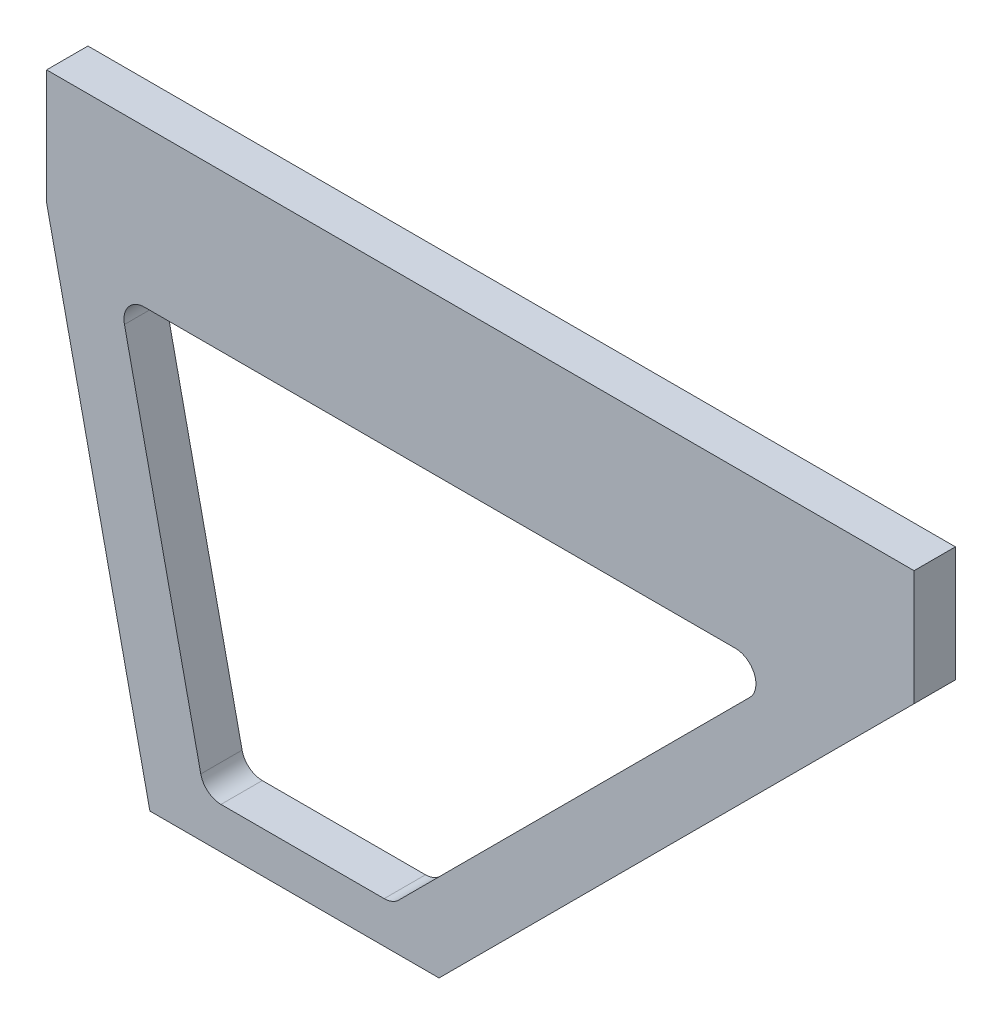
ISO-10303-21;
HEADER;
FILE_DESCRIPTION(('STEP AP214'),'2;1');
FILE_NAME('part.step','',(''),(''),'','','');
FILE_SCHEMA(('AUTOMOTIVE_DESIGN { 1 0 10303 214 1 1 1 1 }'));
ENDSEC;
DATA;
#1=APPLICATION_CONTEXT('core data for automotive mechanical design processes');
#2=APPLICATION_PROTOCOL_DEFINITION('international standard','automotive_design',2000,#1);
#3=PRODUCT_CONTEXT('',#1,'mechanical');
#4=PRODUCT('Part','Part','',(#3));
#5=PRODUCT_RELATED_PRODUCT_CATEGORY('part','',(#4));
#6=PRODUCT_DEFINITION_FORMATION('','',#4);
#7=PRODUCT_DEFINITION_CONTEXT('part definition',#1,'design');
#8=PRODUCT_DEFINITION('design','',#6,#7);
#9=PRODUCT_DEFINITION_SHAPE('','',#8);
#10=(LENGTH_UNIT() NAMED_UNIT(*) SI_UNIT(.MILLI.,.METRE.));
#11=(NAMED_UNIT(*) PLANE_ANGLE_UNIT() SI_UNIT($,.RADIAN.));
#12=(NAMED_UNIT(*) SI_UNIT($,.STERADIAN.) SOLID_ANGLE_UNIT());
#13=UNCERTAINTY_MEASURE_WITH_UNIT(LENGTH_MEASURE(1.E-05),#10,'distance_accuracy_value','');
#14=(GEOMETRIC_REPRESENTATION_CONTEXT(3) GLOBAL_UNCERTAINTY_ASSIGNED_CONTEXT((#13)) GLOBAL_UNIT_ASSIGNED_CONTEXT((#10,
#11,#12)) REPRESENTATION_CONTEXT('',''));
#15=CARTESIAN_POINT('',(0.,0.,0.));
#16=DIRECTION('',(0.,0.,1.));
#17=DIRECTION('',(1.,0.,0.));
#18=AXIS2_PLACEMENT_3D('',#15,#16,#17);
#19=CARTESIAN_POINT('',(0.,0.,5.));
#20=DIRECTION('',(0.,0.,-1.));
#21=DIRECTION('',(-1.,0.,0.));
#22=AXIS2_PLACEMENT_3D('',#19,#20,#21);
#23=PLANE('',#22);
#24=DIRECTION('',(0.,-1.,0.));
#25=VECTOR('',#24,1.);
#26=CARTESIAN_POINT('',(-30.1972094569569,-50.2390348397523,5.));
#27=LINE('',#26,#25);
#28=CARTESIAN_POINT('',(-30.1972094569569,-22.3390348397454,5.));
#29=VERTEX_POINT('',#28);
#30=CARTESIAN_POINT('',(-30.1972094569569,-50.2390348397523,5.));
#31=VERTEX_POINT('',#30);
#32=EDGE_CURVE('E146',#29,#31,#27,.T.);
#33=ORIENTED_EDGE('',*,*,#32,.T.);
#34=DIRECTION('',(0.21242964433104,-0.977176363922802,0.));
#35=VECTOR('',#34,1.);
#36=CARTESIAN_POINT('',(-30.1972094569569,-50.2390348397523,5.));
#37=LINE('',#36,#35);
#38=CARTESIAN_POINT('',(-5.19720945695734,-165.239034839752,5.));
#39=VERTEX_POINT('',#38);
#40=EDGE_CURVE('E135',#31,#39,#37,.T.);
#41=ORIENTED_EDGE('',*,*,#40,.T.);
#42=DIRECTION('',(1.,0.,0.));
#43=VECTOR('',#42,1.);
#44=CARTESIAN_POINT('',(64.8027905430427,-165.239034839752,5.));
#45=LINE('',#44,#43);
#46=CARTESIAN_POINT('',(64.8027905430427,-165.239034839752,5.));
#47=VERTEX_POINT('',#46);
#48=EDGE_CURVE('E145',#39,#47,#45,.T.);
#49=ORIENTED_EDGE('',*,*,#48,.T.);
#50=DIRECTION('',(0.707106781186549,0.707106781186546,0.));
#51=VECTOR('',#50,1.);
#52=CARTESIAN_POINT('',(179.802790543043,-50.2390348397523,5.));
#53=LINE('',#52,#51);
#54=CARTESIAN_POINT('',(179.802790543043,-50.2390348397523,5.));
#55=VERTEX_POINT('',#54);
#56=EDGE_CURVE('E230',#47,#55,#53,.T.);
#57=ORIENTED_EDGE('',*,*,#56,.T.);
#58=DIRECTION('',(0.,1.,0.));
#59=VECTOR('',#58,1.);
#60=CARTESIAN_POINT('',(179.802790543043,-22.3390348397454,5.));
#61=LINE('',#60,#59);
#62=CARTESIAN_POINT('',(179.802790543043,-22.3390348397454,5.));
#63=VERTEX_POINT('',#62);
#64=EDGE_CURVE('E232',#55,#63,#61,.T.);
#65=ORIENTED_EDGE('',*,*,#64,.T.);
#66=DIRECTION('',(-1.,0.,0.));
#67=VECTOR('',#66,1.);
#68=CARTESIAN_POINT('',(-30.1972094569569,-22.3390348397454,5.));
#69=LINE('',#68,#67);
#70=EDGE_CURVE('E150',#63,#29,#69,.T.);
#71=ORIENTED_EDGE('',*,*,#70,.T.);
#72=EDGE_LOOP('',(#33,#41,#49,#57,#65,#71));
#73=FACE_BOUND('',#72,.T.);
#74=DIRECTION('',(1.,0.,0.));
#75=VECTOR('',#74,1.);
#76=CARTESIAN_POINT('',(53.5895871074462,-155.239034839753,5.));
#77=LINE('',#76,#75);
#78=CARTESIAN_POINT('',(12.0090554055467,-155.239034839753,5.));
#79=VERTEX_POINT('',#78);
#80=CARTESIAN_POINT('',(51.5185192955807,-155.239034839753,5.));
#81=VERTEX_POINT('',#80);
#82=EDGE_CURVE('E212',#79,#81,#77,.T.);
#83=ORIENTED_EDGE('',*,*,#82,.F.);
#84=CARTESIAN_POINT('',(12.0090554055467,-150.239034839753,5.));
#85=DIRECTION('',(0.,0.,-1.));
#86=DIRECTION('',(-1.,0.,0.));
#87=AXIS2_PLACEMENT_3D('',#84,#85,#86);
#88=CIRCLE('',#87,5.);
#89=CARTESIAN_POINT('',(7.12317358593271,-151.301183061408,5.));
#90=VERTEX_POINT('',#89);
#91=EDGE_CURVE('E193',#79,#90,#88,.T.);
#92=ORIENTED_EDGE('',*,*,#91,.T.);
#93=DIRECTION('',(0.21242964433104,-0.977176363922802,0.));
#94=VECTOR('',#93,1.);
#95=CARTESIAN_POINT('',(-12.6729455926877,-60.2390348397523,5.));
#96=LINE('',#95,#94);
#97=CARTESIAN_POINT('',(-11.3550872836322,-66.3011830614075,5.));
#98=VERTEX_POINT('',#97);
#99=EDGE_CURVE('E224',#98,#90,#96,.T.);
#100=ORIENTED_EDGE('',*,*,#99,.F.);
#101=CARTESIAN_POINT('',(-6.46920546401825,-65.2390348397523,5.));
#102=DIRECTION('',(0.,0.,-1.));
#103=DIRECTION('',(-1.,0.,0.));
#104=AXIS2_PLACEMENT_3D('',#101,#102,#103);
#105=CIRCLE('',#104,5.);
#106=CARTESIAN_POINT('',(-6.46920546401825,-60.2390348397523,5.));
#107=VERTEX_POINT('',#106);
#108=EDGE_CURVE('E189',#98,#107,#105,.T.);
#109=ORIENTED_EDGE('',*,*,#108,.T.);
#110=DIRECTION('',(-1.,0.,0.));
#111=VECTOR('',#110,1.);
#112=CARTESIAN_POINT('',(148.589587107447,-60.2390348397523,5.));
#113=LINE('',#112,#111);
#114=CARTESIAN_POINT('',(136.518519295581,-60.2390348397523,5.));
#115=VERTEX_POINT('',#114);
#116=EDGE_CURVE('E217',#115,#107,#113,.T.);
#117=ORIENTED_EDGE('',*,*,#116,.F.);
#118=CARTESIAN_POINT('',(136.518519295581,-65.2390348397523,5.));
#119=DIRECTION('',(0.,0.,-1.));
#120=DIRECTION('',(-1.,0.,0.));
#121=AXIS2_PLACEMENT_3D('',#118,#119,#120);
#122=CIRCLE('',#121,5.);
#123=CARTESIAN_POINT('',(140.054053201514,-68.7745687456851,5.));
#124=VERTEX_POINT('',#123);
#125=EDGE_CURVE('E185',#115,#124,#122,.T.);
#126=ORIENTED_EDGE('',*,*,#125,.T.);
#127=DIRECTION('',(0.707106781186547,0.707106781186548,0.));
#128=VECTOR('',#127,1.);
#129=CARTESIAN_POINT('',(53.5895871074462,-155.239034839753,5.));
#130=LINE('',#129,#128);
#131=CARTESIAN_POINT('',(55.0540532015134,-153.774568745685,5.));
#132=VERTEX_POINT('',#131);
#133=EDGE_CURVE('E214',#132,#124,#130,.T.);
#134=ORIENTED_EDGE('',*,*,#133,.F.);
#135=CARTESIAN_POINT('',(51.5185192955807,-150.239034839753,5.));
#136=DIRECTION('',(0.,0.,-1.));
#137=DIRECTION('',(-1.,0.,0.));
#138=AXIS2_PLACEMENT_3D('',#135,#136,#137);
#139=CIRCLE('',#138,5.);
#140=EDGE_CURVE('E11',#132,#81,#139,.T.);
#141=ORIENTED_EDGE('',*,*,#140,.T.);
#142=EDGE_LOOP('',(#83,#92,#100,#109,#117,#126,#134,#141));
#143=FACE_BOUND('',#142,.T.);
#144=ADVANCED_FACE('F34',(#73,#143),#23,.F.);
#145=CARTESIAN_POINT('',(0.,0.,-5.));
#146=DIRECTION('',(0.,0.,-1.));
#147=DIRECTION('',(-1.,0.,0.));
#148=AXIS2_PLACEMENT_3D('',#145,#146,#147);
#149=PLANE('',#148);
#150=DIRECTION('',(0.,-1.,0.));
#151=VECTOR('',#150,1.);
#152=CARTESIAN_POINT('',(-30.1972094569569,-50.2390348397523,-5.));
#153=LINE('',#152,#151);
#154=CARTESIAN_POINT('',(-30.1972094569569,-22.3390348397454,-5.));
#155=VERTEX_POINT('',#154);
#156=CARTESIAN_POINT('',(-30.1972094569569,-50.2390348397523,-5.));
#157=VERTEX_POINT('',#156);
#158=EDGE_CURVE('E158',#155,#157,#153,.T.);
#159=ORIENTED_EDGE('',*,*,#158,.F.);
#160=DIRECTION('',(-1.,0.,0.));
#161=VECTOR('',#160,1.);
#162=CARTESIAN_POINT('',(-30.1972094569569,-22.3390348397454,-5.));
#163=LINE('',#162,#161);
#164=CARTESIAN_POINT('',(179.802790543043,-22.3390348397454,-5.));
#165=VERTEX_POINT('',#164);
#166=EDGE_CURVE('E154',#165,#155,#163,.T.);
#167=ORIENTED_EDGE('',*,*,#166,.F.);
#168=DIRECTION('',(0.,1.,0.));
#169=VECTOR('',#168,1.);
#170=CARTESIAN_POINT('',(179.802790543043,-22.3390348397454,-5.));
#171=LINE('',#170,#169);
#172=CARTESIAN_POINT('',(179.802790543043,-50.2390348397523,-5.));
#173=VERTEX_POINT('',#172);
#174=EDGE_CURVE('E243',#173,#165,#171,.T.);
#175=ORIENTED_EDGE('',*,*,#174,.F.);
#176=DIRECTION('',(0.707106781186549,0.707106781186546,0.));
#177=VECTOR('',#176,1.);
#178=CARTESIAN_POINT('',(179.802790543043,-50.2390348397523,-5.));
#179=LINE('',#178,#177);
#180=CARTESIAN_POINT('',(64.8027905430427,-165.239034839752,-5.));
#181=VERTEX_POINT('',#180);
#182=EDGE_CURVE('E241',#181,#173,#179,.T.);
#183=ORIENTED_EDGE('',*,*,#182,.F.);
#184=DIRECTION('',(1.,0.,0.));
#185=VECTOR('',#184,1.);
#186=CARTESIAN_POINT('',(64.8027905430427,-165.239034839752,-5.));
#187=LINE('',#186,#185);
#188=CARTESIAN_POINT('',(-5.19720945695734,-165.239034839752,-5.));
#189=VERTEX_POINT('',#188);
#190=EDGE_CURVE('E239',#189,#181,#187,.T.);
#191=ORIENTED_EDGE('',*,*,#190,.F.);
#192=DIRECTION('',(0.21242964433104,-0.977176363922802,0.));
#193=VECTOR('',#192,1.);
#194=CARTESIAN_POINT('',(-30.1972094569569,-50.2390348397523,-5.));
#195=LINE('',#194,#193);
#196=EDGE_CURVE('E237',#157,#189,#195,.T.);
#197=ORIENTED_EDGE('',*,*,#196,.F.);
#198=EDGE_LOOP('',(#159,#167,#175,#183,#191,#197));
#199=FACE_BOUND('',#198,.T.);
#200=DIRECTION('',(-1.,0.,0.));
#201=VECTOR('',#200,1.);
#202=CARTESIAN_POINT('',(148.589587107447,-60.2390348397523,-5.));
#203=LINE('',#202,#201);
#204=CARTESIAN_POINT('',(136.518519295581,-60.2390348397523,-5.));
#205=VERTEX_POINT('',#204);
#206=CARTESIAN_POINT('',(-6.46920546401825,-60.2390348397523,-5.));
#207=VERTEX_POINT('',#206);
#208=EDGE_CURVE('E209',#205,#207,#203,.T.);
#209=ORIENTED_EDGE('',*,*,#208,.T.);
#210=CARTESIAN_POINT('',(-6.46920546401825,-65.2390348397523,-5.));
#211=DIRECTION('',(0.,0.,-1.));
#212=DIRECTION('',(-1.,0.,0.));
#213=AXIS2_PLACEMENT_3D('',#210,#211,#212);
#214=CIRCLE('',#213,5.);
#215=CARTESIAN_POINT('',(-11.3550872836322,-66.3011830614075,-5.));
#216=VERTEX_POINT('',#215);
#217=EDGE_CURVE('E187',#207,#216,#214,.F.);
#218=ORIENTED_EDGE('',*,*,#217,.T.);
#219=DIRECTION('',(0.21242964433104,-0.977176363922802,0.));
#220=VECTOR('',#219,1.);
#221=CARTESIAN_POINT('',(-12.6729455926877,-60.2390348397523,-5.));
#222=LINE('',#221,#220);
#223=CARTESIAN_POINT('',(7.12317358593271,-151.301183061408,-5.));
#224=VERTEX_POINT('',#223);
#225=EDGE_CURVE('E215',#216,#224,#222,.T.);
#226=ORIENTED_EDGE('',*,*,#225,.T.);
#227=CARTESIAN_POINT('',(12.0090554055467,-150.239034839753,-5.));
#228=DIRECTION('',(0.,0.,-1.));
#229=DIRECTION('',(-1.,0.,0.));
#230=AXIS2_PLACEMENT_3D('',#227,#228,#229);
#231=CIRCLE('',#230,5.);
#232=CARTESIAN_POINT('',(12.0090554055467,-155.239034839753,-5.));
#233=VERTEX_POINT('',#232);
#234=EDGE_CURVE('E191',#224,#233,#231,.F.);
#235=ORIENTED_EDGE('',*,*,#234,.T.);
#236=DIRECTION('',(1.,0.,0.));
#237=VECTOR('',#236,1.);
#238=CARTESIAN_POINT('',(53.5895871074462,-155.239034839753,-5.));
#239=LINE('',#238,#237);
#240=CARTESIAN_POINT('',(51.5185192955807,-155.239034839753,-5.));
#241=VERTEX_POINT('',#240);
#242=EDGE_CURVE('E201',#233,#241,#239,.T.);
#243=ORIENTED_EDGE('',*,*,#242,.T.);
#244=CARTESIAN_POINT('',(51.5185192955807,-150.239034839753,-5.));
#245=DIRECTION('',(0.,0.,-1.));
#246=DIRECTION('',(-1.,0.,0.));
#247=AXIS2_PLACEMENT_3D('',#244,#245,#246);
#248=CIRCLE('',#247,5.);
#249=CARTESIAN_POINT('',(55.0540532015134,-153.774568745685,-5.));
#250=VERTEX_POINT('',#249);
#251=EDGE_CURVE('E42',#241,#250,#248,.F.);
#252=ORIENTED_EDGE('',*,*,#251,.T.);
#253=DIRECTION('',(0.707106781186547,0.707106781186548,0.));
#254=VECTOR('',#253,1.);
#255=CARTESIAN_POINT('',(53.5895871074462,-155.239034839753,-5.));
#256=LINE('',#255,#254);
#257=CARTESIAN_POINT('',(140.054053201514,-68.7745687456851,-5.));
#258=VERTEX_POINT('',#257);
#259=EDGE_CURVE('E200',#250,#258,#256,.T.);
#260=ORIENTED_EDGE('',*,*,#259,.T.);
#261=CARTESIAN_POINT('',(136.518519295581,-65.2390348397523,-5.));
#262=DIRECTION('',(0.,0.,-1.));
#263=DIRECTION('',(-1.,0.,0.));
#264=AXIS2_PLACEMENT_3D('',#261,#262,#263);
#265=CIRCLE('',#264,5.);
#266=EDGE_CURVE('E183',#258,#205,#265,.F.);
#267=ORIENTED_EDGE('',*,*,#266,.T.);
#268=EDGE_LOOP('',(#209,#218,#226,#235,#243,#252,#260,#267));
#269=FACE_BOUND('',#268,.T.);
#270=ADVANCED_FACE('F199',(#199,#269),#149,.T.);
#271=CARTESIAN_POINT('',(-30.1972094569569,-50.2390348397523,5.));
#272=DIRECTION('',(1.,0.,0.));
#273=DIRECTION('',(0.,0.,-1.));
#274=AXIS2_PLACEMENT_3D('',#271,#272,#273);
#275=PLANE('',#274);
#276=ORIENTED_EDGE('',*,*,#158,.T.);
#277=DIRECTION('',(0.,0.,-1.));
#278=VECTOR('',#277,1.);
#279=CARTESIAN_POINT('',(-30.1972094569569,-50.2390348397523,5.));
#280=LINE('',#279,#278);
#281=EDGE_CURVE('E139',#31,#157,#280,.T.);
#282=ORIENTED_EDGE('',*,*,#281,.F.);
#283=ORIENTED_EDGE('',*,*,#32,.F.);
#284=DIRECTION('',(0.,0.,-1.));
#285=VECTOR('',#284,1.);
#286=CARTESIAN_POINT('',(-30.1972094569569,-22.3390348397454,5.));
#287=LINE('',#286,#285);
#288=EDGE_CURVE('E235',#29,#155,#287,.T.);
#289=ORIENTED_EDGE('',*,*,#288,.T.);
#290=EDGE_LOOP('',(#276,#282,#283,#289));
#291=FACE_BOUND('',#290,.T.);
#292=ADVANCED_FACE('F156',(#291),#275,.F.);
#293=CARTESIAN_POINT('',(-30.1972094569569,-50.2390348397523,5.));
#294=DIRECTION('',(0.977176363922802,0.21242964433104,0.));
#295=DIRECTION('',(-0.21242964433104,0.977176363922802,0.));
#296=AXIS2_PLACEMENT_3D('',#293,#294,#295);
#297=PLANE('',#296);
#298=ORIENTED_EDGE('',*,*,#196,.T.);
#299=DIRECTION('',(0.,0.,-1.));
#300=VECTOR('',#299,1.);
#301=CARTESIAN_POINT('',(-5.19720945695734,-165.239034839752,5.));
#302=LINE('',#301,#300);
#303=EDGE_CURVE('E142',#39,#189,#302,.T.);
#304=ORIENTED_EDGE('',*,*,#303,.F.);
#305=ORIENTED_EDGE('',*,*,#40,.F.);
#306=ORIENTED_EDGE('',*,*,#281,.T.);
#307=EDGE_LOOP('',(#298,#304,#305,#306));
#308=FACE_BOUND('',#307,.T.);
#309=ADVANCED_FACE('F137',(#308),#297,.F.);
#310=CARTESIAN_POINT('',(64.8027905430427,-165.239034839752,5.));
#311=DIRECTION('',(0.,1.,0.));
#312=DIRECTION('',(0.,0.,1.));
#313=AXIS2_PLACEMENT_3D('',#310,#311,#312);
#314=PLANE('',#313);
#315=ORIENTED_EDGE('',*,*,#190,.T.);
#316=DIRECTION('',(0.,0.,-1.));
#317=VECTOR('',#316,1.);
#318=CARTESIAN_POINT('',(64.8027905430427,-165.239034839752,5.));
#319=LINE('',#318,#317);
#320=EDGE_CURVE('E163',#47,#181,#319,.T.);
#321=ORIENTED_EDGE('',*,*,#320,.F.);
#322=ORIENTED_EDGE('',*,*,#48,.F.);
#323=ORIENTED_EDGE('',*,*,#303,.T.);
#324=EDGE_LOOP('',(#315,#321,#322,#323));
#325=FACE_BOUND('',#324,.T.);
#326=ADVANCED_FACE('F270',(#325),#314,.F.);
#327=CARTESIAN_POINT('',(179.802790543043,-50.2390348397523,5.));
#328=DIRECTION('',(-0.707106781186546,0.707106781186549,0.));
#329=DIRECTION('',(-0.707106781186549,-0.707106781186546,0.));
#330=AXIS2_PLACEMENT_3D('',#327,#328,#329);
#331=PLANE('',#330);
#332=ORIENTED_EDGE('',*,*,#182,.T.);
#333=DIRECTION('',(0.,0.,-1.));
#334=VECTOR('',#333,1.);
#335=CARTESIAN_POINT('',(179.802790543043,-50.2390348397523,5.));
#336=LINE('',#335,#334);
#337=EDGE_CURVE('E250',#55,#173,#336,.T.);
#338=ORIENTED_EDGE('',*,*,#337,.F.);
#339=ORIENTED_EDGE('',*,*,#56,.F.);
#340=ORIENTED_EDGE('',*,*,#320,.T.);
#341=EDGE_LOOP('',(#332,#338,#339,#340));
#342=FACE_BOUND('',#341,.T.);
#343=ADVANCED_FACE('F257',(#342),#331,.F.);
#344=CARTESIAN_POINT('',(179.802790543043,-22.3390348397454,5.));
#345=DIRECTION('',(-1.,0.,0.));
#346=DIRECTION('',(0.,0.,1.));
#347=AXIS2_PLACEMENT_3D('',#344,#345,#346);
#348=PLANE('',#347);
#349=ORIENTED_EDGE('',*,*,#174,.T.);
#350=DIRECTION('',(0.,0.,-1.));
#351=VECTOR('',#350,1.);
#352=CARTESIAN_POINT('',(179.802790543043,-22.3390348397454,5.));
#353=LINE('',#352,#351);
#354=EDGE_CURVE('E247',#63,#165,#353,.T.);
#355=ORIENTED_EDGE('',*,*,#354,.F.);
#356=ORIENTED_EDGE('',*,*,#64,.F.);
#357=ORIENTED_EDGE('',*,*,#337,.T.);
#358=EDGE_LOOP('',(#349,#355,#356,#357));
#359=FACE_BOUND('',#358,.T.);
#360=ADVANCED_FACE('F266',(#359),#348,.F.);
#361=CARTESIAN_POINT('',(-30.1972094569569,-22.3390348397454,5.));
#362=DIRECTION('',(0.,-1.,0.));
#363=DIRECTION('',(0.,0.,-1.));
#364=AXIS2_PLACEMENT_3D('',#361,#362,#363);
#365=PLANE('',#364);
#366=ORIENTED_EDGE('',*,*,#166,.T.);
#367=ORIENTED_EDGE('',*,*,#288,.F.);
#368=ORIENTED_EDGE('',*,*,#70,.F.);
#369=ORIENTED_EDGE('',*,*,#354,.T.);
#370=EDGE_LOOP('',(#366,#367,#368,#369));
#371=FACE_BOUND('',#370,.T.);
#372=ADVANCED_FACE('F269',(#371),#365,.F.);
#373=CARTESIAN_POINT('',(53.5895871074462,-155.239034839753,5.));
#374=DIRECTION('',(0.,1.,0.));
#375=DIRECTION('',(-1.,0.,0.));
#376=AXIS2_PLACEMENT_3D('',#373,#374,#375);
#377=PLANE('',#376);
#378=ORIENTED_EDGE('',*,*,#242,.F.);
#379=DIRECTION('',(0.,0.,-1.));
#380=VECTOR('',#379,1.);
#381=CARTESIAN_POINT('',(12.0090554055467,-155.239034839753,5.));
#382=LINE('',#381,#380);
#383=EDGE_CURVE('E54',#233,#79,#382,.F.);
#384=ORIENTED_EDGE('',*,*,#383,.T.);
#385=ORIENTED_EDGE('',*,*,#82,.T.);
#386=DIRECTION('',(0.,0.,-1.));
#387=VECTOR('',#386,1.);
#388=CARTESIAN_POINT('',(51.5185192955807,-155.239034839753,-5.));
#389=LINE('',#388,#387);
#390=EDGE_CURVE('E179',#81,#241,#389,.T.);
#391=ORIENTED_EDGE('',*,*,#390,.T.);
#392=EDGE_LOOP('',(#378,#384,#385,#391));
#393=FACE_BOUND('',#392,.T.);
#394=ADVANCED_FACE('F211',(#393),#377,.T.);
#395=CARTESIAN_POINT('',(53.5895871074462,-155.239034839753,5.));
#396=DIRECTION('',(-0.707106781186548,0.707106781186547,0.));
#397=DIRECTION('',(-0.707106781186547,-0.707106781186548,0.));
#398=AXIS2_PLACEMENT_3D('',#395,#396,#397);
#399=PLANE('',#398);
#400=ORIENTED_EDGE('',*,*,#133,.T.);
#401=DIRECTION('',(0.,0.,-1.));
#402=VECTOR('',#401,1.);
#403=CARTESIAN_POINT('',(140.054053201514,-68.774568745685,-5.));
#404=LINE('',#403,#402);
#405=EDGE_CURVE('E161',#124,#258,#404,.T.);
#406=ORIENTED_EDGE('',*,*,#405,.T.);
#407=ORIENTED_EDGE('',*,*,#259,.F.);
#408=DIRECTION('',(0.,0.,-1.));
#409=VECTOR('',#408,1.);
#410=CARTESIAN_POINT('',(55.0540532015134,-153.774568745685,5.));
#411=LINE('',#410,#409);
#412=EDGE_CURVE('E159',#250,#132,#411,.F.);
#413=ORIENTED_EDGE('',*,*,#412,.T.);
#414=EDGE_LOOP('',(#400,#406,#407,#413));
#415=FACE_BOUND('',#414,.T.);
#416=ADVANCED_FACE('F207',(#415),#399,.T.);
#417=CARTESIAN_POINT('',(148.589587107447,-60.2390348397523,5.));
#418=DIRECTION('',(0.,-1.,0.));
#419=DIRECTION('',(1.,0.,0.));
#420=AXIS2_PLACEMENT_3D('',#417,#418,#419);
#421=PLANE('',#420);
#422=ORIENTED_EDGE('',*,*,#208,.F.);
#423=DIRECTION('',(0.,0.,-1.));
#424=VECTOR('',#423,1.);
#425=CARTESIAN_POINT('',(136.518519295581,-60.2390348397523,5.));
#426=LINE('',#425,#424);
#427=EDGE_CURVE('E172',#205,#115,#426,.F.);
#428=ORIENTED_EDGE('',*,*,#427,.T.);
#429=ORIENTED_EDGE('',*,*,#116,.T.);
#430=DIRECTION('',(0.,0.,-1.));
#431=VECTOR('',#430,1.);
#432=CARTESIAN_POINT('',(-6.46920546401825,-60.2390348397523,-5.));
#433=LINE('',#432,#431);
#434=EDGE_CURVE('E169',#107,#207,#433,.T.);
#435=ORIENTED_EDGE('',*,*,#434,.T.);
#436=EDGE_LOOP('',(#422,#428,#429,#435));
#437=FACE_BOUND('',#436,.T.);
#438=ADVANCED_FACE('F311',(#437),#421,.T.);
#439=CARTESIAN_POINT('',(-12.6729455926877,-60.2390348397523,5.));
#440=DIRECTION('',(0.977176363922802,0.21242964433104,0.));
#441=DIRECTION('',(-0.21242964433104,0.977176363922802,0.));
#442=AXIS2_PLACEMENT_3D('',#439,#440,#441);
#443=PLANE('',#442);
#444=ORIENTED_EDGE('',*,*,#225,.F.);
#445=DIRECTION('',(0.,0.,-1.));
#446=VECTOR('',#445,1.);
#447=CARTESIAN_POINT('',(-11.3550872836322,-66.3011830614075,5.));
#448=LINE('',#447,#446);
#449=EDGE_CURVE('E177',#216,#98,#448,.F.);
#450=ORIENTED_EDGE('',*,*,#449,.T.);
#451=ORIENTED_EDGE('',*,*,#99,.T.);
#452=DIRECTION('',(0.,0.,-1.));
#453=VECTOR('',#452,1.);
#454=CARTESIAN_POINT('',(7.12317358593271,-151.301183061408,-5.));
#455=LINE('',#454,#453);
#456=EDGE_CURVE('E174',#90,#224,#455,.T.);
#457=ORIENTED_EDGE('',*,*,#456,.T.);
#458=EDGE_LOOP('',(#444,#450,#451,#457));
#459=FACE_BOUND('',#458,.T.);
#460=ADVANCED_FACE('F317',(#459),#443,.T.);
#461=CARTESIAN_POINT('',(136.518519295581,-65.2390348397523,5.));
#462=DIRECTION('',(0.,0.,1.));
#463=DIRECTION('',(1.,0.,0.));
#464=AXIS2_PLACEMENT_3D('',#461,#462,#463);
#465=CYLINDRICAL_SURFACE('',#464,5.);
#466=ORIENTED_EDGE('',*,*,#125,.F.);
#467=ORIENTED_EDGE('',*,*,#427,.F.);
#468=ORIENTED_EDGE('',*,*,#266,.F.);
#469=ORIENTED_EDGE('',*,*,#405,.F.);
#470=EDGE_LOOP('',(#466,#467,#468,#469));
#471=FACE_BOUND('',#470,.T.);
#472=ADVANCED_FACE('F325',(#471),#465,.F.);
#473=CARTESIAN_POINT('',(-6.46920546401825,-65.2390348397523,5.));
#474=DIRECTION('',(0.,0.,1.));
#475=DIRECTION('',(1.,0.,0.));
#476=AXIS2_PLACEMENT_3D('',#473,#474,#475);
#477=CYLINDRICAL_SURFACE('',#476,5.);
#478=ORIENTED_EDGE('',*,*,#108,.F.);
#479=ORIENTED_EDGE('',*,*,#449,.F.);
#480=ORIENTED_EDGE('',*,*,#217,.F.);
#481=ORIENTED_EDGE('',*,*,#434,.F.);
#482=EDGE_LOOP('',(#478,#479,#480,#481));
#483=FACE_BOUND('',#482,.T.);
#484=ADVANCED_FACE('F333',(#483),#477,.F.);
#485=CARTESIAN_POINT('',(12.0090554055467,-150.239034839753,5.));
#486=DIRECTION('',(0.,0.,1.));
#487=DIRECTION('',(1.,0.,0.));
#488=AXIS2_PLACEMENT_3D('',#485,#486,#487);
#489=CYLINDRICAL_SURFACE('',#488,5.);
#490=ORIENTED_EDGE('',*,*,#91,.F.);
#491=ORIENTED_EDGE('',*,*,#383,.F.);
#492=ORIENTED_EDGE('',*,*,#234,.F.);
#493=ORIENTED_EDGE('',*,*,#456,.F.);
#494=EDGE_LOOP('',(#490,#491,#492,#493));
#495=FACE_BOUND('',#494,.T.);
#496=ADVANCED_FACE('F341',(#495),#489,.F.);
#497=CARTESIAN_POINT('',(51.5185192955807,-150.239034839753,5.));
#498=DIRECTION('',(0.,0.,1.));
#499=DIRECTION('',(1.,0.,0.));
#500=AXIS2_PLACEMENT_3D('',#497,#498,#499);
#501=CYLINDRICAL_SURFACE('',#500,5.);
#502=ORIENTED_EDGE('',*,*,#140,.F.);
#503=ORIENTED_EDGE('',*,*,#412,.F.);
#504=ORIENTED_EDGE('',*,*,#251,.F.);
#505=ORIENTED_EDGE('',*,*,#390,.F.);
#506=EDGE_LOOP('',(#502,#503,#504,#505));
#507=FACE_BOUND('',#506,.T.);
#508=ADVANCED_FACE('F36',(#507),#501,.F.);
#509=CLOSED_SHELL('',(#144,#270,#292,#309,#326,#343,#360,#372,#394,#416,#438,#460,#472,#484,
#496,#508));
#510=MANIFOLD_SOLID_BREP('B2',#509);
#511=ADVANCED_BREP_SHAPE_REPRESENTATION('',(#18,#510),#14);
#512=SHAPE_DEFINITION_REPRESENTATION(#9,#511);
ENDSEC;
END-ISO-10303-21;
